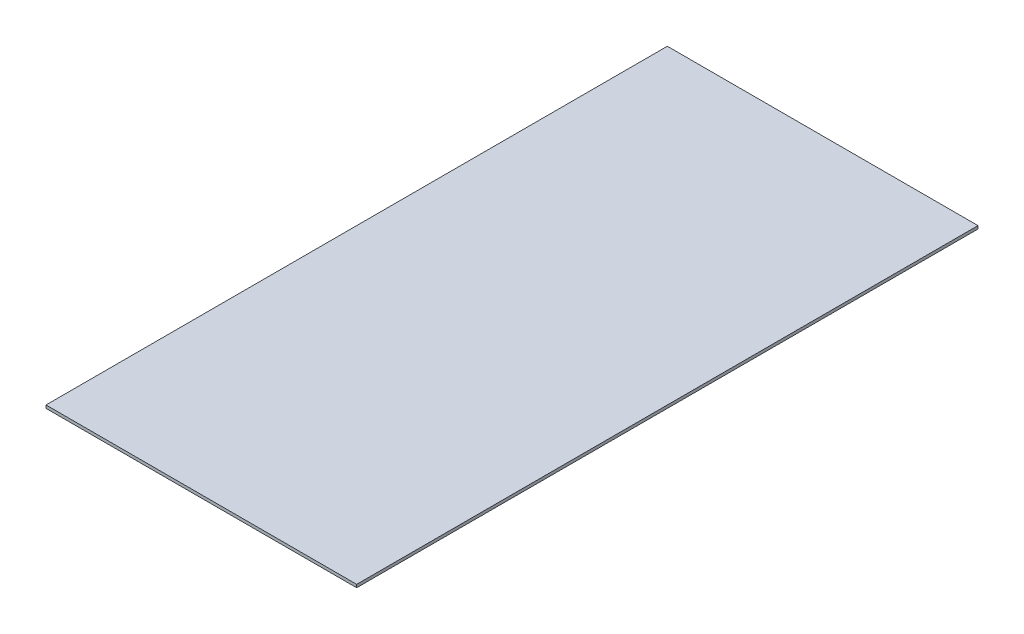
ISO-10303-21;
HEADER;
FILE_DESCRIPTION(('STEP AP214'),'2;1');
FILE_NAME('part.step','',(''),(''),'','','');
FILE_SCHEMA(('AUTOMOTIVE_DESIGN { 1 0 10303 214 1 1 1 1 }'));
ENDSEC;
DATA;
#1=APPLICATION_CONTEXT('core data for automotive mechanical design processes');
#2=APPLICATION_PROTOCOL_DEFINITION('international standard','automotive_design',2000,#1);
#3=PRODUCT_CONTEXT('',#1,'mechanical');
#4=PRODUCT('Part','Part','',(#3));
#5=PRODUCT_RELATED_PRODUCT_CATEGORY('part','',(#4));
#6=PRODUCT_DEFINITION_FORMATION('','',#4);
#7=PRODUCT_DEFINITION_CONTEXT('part definition',#1,'design');
#8=PRODUCT_DEFINITION('design','',#6,#7);
#9=PRODUCT_DEFINITION_SHAPE('','',#8);
#10=(LENGTH_UNIT() NAMED_UNIT(*) SI_UNIT(.MILLI.,.METRE.));
#11=(NAMED_UNIT(*) PLANE_ANGLE_UNIT() SI_UNIT($,.RADIAN.));
#12=(NAMED_UNIT(*) SI_UNIT($,.STERADIAN.) SOLID_ANGLE_UNIT());
#13=UNCERTAINTY_MEASURE_WITH_UNIT(LENGTH_MEASURE(1.E-05),#10,'distance_accuracy_value','');
#14=(GEOMETRIC_REPRESENTATION_CONTEXT(3) GLOBAL_UNCERTAINTY_ASSIGNED_CONTEXT((#13)) GLOBAL_UNIT_ASSIGNED_CONTEXT((#10,
#11,#12)) REPRESENTATION_CONTEXT('',''));
#15=CARTESIAN_POINT('',(0.,0.,0.));
#16=DIRECTION('',(0.,0.,1.));
#17=DIRECTION('',(1.,0.,0.));
#18=AXIS2_PLACEMENT_3D('',#15,#16,#17);
#19=CARTESIAN_POINT('',(152.4,1.4605,304.8));
#20=DIRECTION('',(-1.,0.,0.));
#21=DIRECTION('',(0.,0.,1.));
#22=AXIS2_PLACEMENT_3D('',#19,#20,#21);
#23=PLANE('',#22);
#24=DIRECTION('',(0.,0.,-1.));
#25=VECTOR('',#24,1.);
#26=CARTESIAN_POINT('',(152.4,-1.4605,304.8));
#27=LINE('',#26,#25);
#28=CARTESIAN_POINT('',(152.4,-1.4605,304.8));
#29=VERTEX_POINT('',#28);
#30=CARTESIAN_POINT('',(152.4,-1.4605,-304.8));
#31=VERTEX_POINT('',#30);
#32=EDGE_CURVE('E113',#29,#31,#27,.T.);
#33=ORIENTED_EDGE('',*,*,#32,.T.);
#34=DIRECTION('',(0.,-1.,0.));
#35=VECTOR('',#34,1.);
#36=CARTESIAN_POINT('',(152.4,1.4605,-304.8));
#37=LINE('',#36,#35);
#38=CARTESIAN_POINT('',(152.4,1.4605,-304.8));
#39=VERTEX_POINT('',#38);
#40=EDGE_CURVE('E11',#39,#31,#37,.T.);
#41=ORIENTED_EDGE('',*,*,#40,.F.);
#42=DIRECTION('',(0.,0.,-1.));
#43=VECTOR('',#42,1.);
#44=CARTESIAN_POINT('',(152.4,1.4605,304.8));
#45=LINE('',#44,#43);
#46=CARTESIAN_POINT('',(152.4,1.4605,304.8));
#47=VERTEX_POINT('',#46);
#48=EDGE_CURVE('E97',#47,#39,#45,.T.);
#49=ORIENTED_EDGE('',*,*,#48,.F.);
#50=DIRECTION('',(0.,-1.,0.));
#51=VECTOR('',#50,1.);
#52=CARTESIAN_POINT('',(152.4,1.4605,304.8));
#53=LINE('',#52,#51);
#54=EDGE_CURVE('E109',#47,#29,#53,.T.);
#55=ORIENTED_EDGE('',*,*,#54,.T.);
#56=EDGE_LOOP('',(#33,#41,#49,#55));
#57=FACE_BOUND('',#56,.T.);
#58=ADVANCED_FACE('F45',(#57),#23,.F.);
#59=CARTESIAN_POINT('',(-152.4,1.4605,-304.8));
#60=DIRECTION('',(0.,0.,1.));
#61=DIRECTION('',(1.,0.,0.));
#62=AXIS2_PLACEMENT_3D('',#59,#60,#61);
#63=PLANE('',#62);
#64=DIRECTION('',(-1.,0.,0.));
#65=VECTOR('',#64,1.);
#66=CARTESIAN_POINT('',(-152.4,-1.4605,-304.8));
#67=LINE('',#66,#65);
#68=CARTESIAN_POINT('',(-152.4,-1.4605,-304.8));
#69=VERTEX_POINT('',#68);
#70=EDGE_CURVE('E102',#31,#69,#67,.T.);
#71=ORIENTED_EDGE('',*,*,#70,.T.);
#72=DIRECTION('',(0.,-1.,0.));
#73=VECTOR('',#72,1.);
#74=CARTESIAN_POINT('',(-152.4,1.4605,-304.8));
#75=LINE('',#74,#73);
#76=CARTESIAN_POINT('',(-152.4,1.4605,-304.8));
#77=VERTEX_POINT('',#76);
#78=EDGE_CURVE('E54',#77,#69,#75,.T.);
#79=ORIENTED_EDGE('',*,*,#78,.F.);
#80=DIRECTION('',(-1.,0.,0.));
#81=VECTOR('',#80,1.);
#82=CARTESIAN_POINT('',(-152.4,1.4605,-304.8));
#83=LINE('',#82,#81);
#84=EDGE_CURVE('E92',#39,#77,#83,.T.);
#85=ORIENTED_EDGE('',*,*,#84,.F.);
#86=ORIENTED_EDGE('',*,*,#40,.T.);
#87=EDGE_LOOP('',(#71,#79,#85,#86));
#88=FACE_BOUND('',#87,.T.);
#89=ADVANCED_FACE('F101',(#88),#63,.F.);
#90=CARTESIAN_POINT('',(-152.4,1.4605,304.8));
#91=DIRECTION('',(1.,0.,0.));
#92=DIRECTION('',(0.,0.,-1.));
#93=AXIS2_PLACEMENT_3D('',#90,#91,#92);
#94=PLANE('',#93);
#95=DIRECTION('',(0.,0.,1.));
#96=VECTOR('',#95,1.);
#97=CARTESIAN_POINT('',(-152.4,-1.4605,304.8));
#98=LINE('',#97,#96);
#99=CARTESIAN_POINT('',(-152.4,-1.4605,304.8));
#100=VERTEX_POINT('',#99);
#101=EDGE_CURVE('E79',#69,#100,#98,.T.);
#102=ORIENTED_EDGE('',*,*,#101,.T.);
#103=DIRECTION('',(0.,-1.,0.));
#104=VECTOR('',#103,1.);
#105=CARTESIAN_POINT('',(-152.4,1.4605,304.8));
#106=LINE('',#105,#104);
#107=CARTESIAN_POINT('',(-152.4,1.4605,304.8));
#108=VERTEX_POINT('',#107);
#109=EDGE_CURVE('E104',#108,#100,#106,.T.);
#110=ORIENTED_EDGE('',*,*,#109,.F.);
#111=DIRECTION('',(0.,0.,1.));
#112=VECTOR('',#111,1.);
#113=CARTESIAN_POINT('',(-152.4,1.4605,304.8));
#114=LINE('',#113,#112);
#115=EDGE_CURVE('E95',#77,#108,#114,.T.);
#116=ORIENTED_EDGE('',*,*,#115,.F.);
#117=ORIENTED_EDGE('',*,*,#78,.T.);
#118=EDGE_LOOP('',(#102,#110,#116,#117));
#119=FACE_BOUND('',#118,.T.);
#120=ADVANCED_FACE('F105',(#119),#94,.F.);
#121=CARTESIAN_POINT('',(-152.4,1.4605,304.8));
#122=DIRECTION('',(0.,0.,-1.));
#123=DIRECTION('',(-1.,0.,0.));
#124=AXIS2_PLACEMENT_3D('',#121,#122,#123);
#125=PLANE('',#124);
#126=DIRECTION('',(1.,0.,0.));
#127=VECTOR('',#126,1.);
#128=CARTESIAN_POINT('',(-152.4,-1.4605,304.8));
#129=LINE('',#128,#127);
#130=EDGE_CURVE('E85',#100,#29,#129,.T.);
#131=ORIENTED_EDGE('',*,*,#130,.T.);
#132=ORIENTED_EDGE('',*,*,#54,.F.);
#133=DIRECTION('',(1.,0.,0.));
#134=VECTOR('',#133,1.);
#135=CARTESIAN_POINT('',(-152.4,1.4605,304.8));
#136=LINE('',#135,#134);
#137=EDGE_CURVE('E62',#108,#47,#136,.T.);
#138=ORIENTED_EDGE('',*,*,#137,.F.);
#139=ORIENTED_EDGE('',*,*,#109,.T.);
#140=EDGE_LOOP('',(#131,#132,#138,#139));
#141=FACE_BOUND('',#140,.T.);
#142=ADVANCED_FACE('F126',(#141),#125,.F.);
#143=CARTESIAN_POINT('',(0.,1.4605,0.));
#144=DIRECTION('',(0.,-1.,0.));
#145=DIRECTION('',(0.,0.,-1.));
#146=AXIS2_PLACEMENT_3D('',#143,#144,#145);
#147=PLANE('',#146);
#148=ORIENTED_EDGE('',*,*,#48,.T.);
#149=ORIENTED_EDGE('',*,*,#84,.T.);
#150=ORIENTED_EDGE('',*,*,#115,.T.);
#151=ORIENTED_EDGE('',*,*,#137,.T.);
#152=EDGE_LOOP('',(#148,#149,#150,#151));
#153=FACE_BOUND('',#152,.T.);
#154=ADVANCED_FACE('F93',(#153),#147,.F.);
#155=CARTESIAN_POINT('',(0.,-1.4605,0.));
#156=DIRECTION('',(0.,-1.,0.));
#157=DIRECTION('',(0.,0.,-1.));
#158=AXIS2_PLACEMENT_3D('',#155,#156,#157);
#159=PLANE('',#158);
#160=ORIENTED_EDGE('',*,*,#32,.F.);
#161=ORIENTED_EDGE('',*,*,#130,.F.);
#162=ORIENTED_EDGE('',*,*,#101,.F.);
#163=ORIENTED_EDGE('',*,*,#70,.F.);
#164=EDGE_LOOP('',(#160,#161,#162,#163));
#165=FACE_BOUND('',#164,.T.);
#166=ADVANCED_FACE('F129',(#165),#159,.T.);
#167=CLOSED_SHELL('',(#58,#89,#120,#142,#154,#166));
#168=MANIFOLD_SOLID_BREP('B2',#167);
#169=ADVANCED_BREP_SHAPE_REPRESENTATION('',(#18,#168),#14);
#170=SHAPE_DEFINITION_REPRESENTATION(#9,#169);
ENDSEC;
END-ISO-10303-21;
